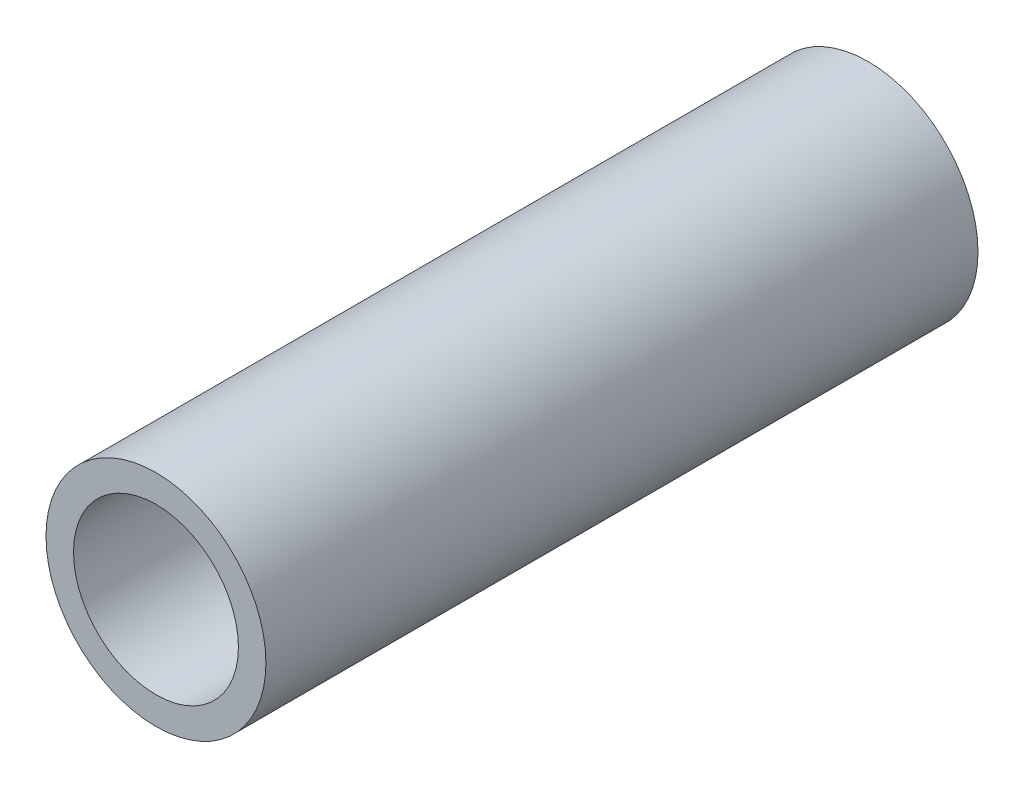
ISO-10303-21;
HEADER;
FILE_DESCRIPTION(('STEP AP214'),'2;1');
FILE_NAME('part.step','',(''),(''),'','','');
FILE_SCHEMA(('AUTOMOTIVE_DESIGN { 1 0 10303 214 1 1 1 1 }'));
ENDSEC;
DATA;
#1=APPLICATION_CONTEXT('core data for automotive mechanical design processes');
#2=APPLICATION_PROTOCOL_DEFINITION('international standard','automotive_design',2000,#1);
#3=PRODUCT_CONTEXT('',#1,'mechanical');
#4=PRODUCT('Part','Part','',(#3));
#5=PRODUCT_RELATED_PRODUCT_CATEGORY('part','',(#4));
#6=PRODUCT_DEFINITION_FORMATION('','',#4);
#7=PRODUCT_DEFINITION_CONTEXT('part definition',#1,'design');
#8=PRODUCT_DEFINITION('design','',#6,#7);
#9=PRODUCT_DEFINITION_SHAPE('','',#8);
#10=(LENGTH_UNIT() NAMED_UNIT(*) SI_UNIT(.MILLI.,.METRE.));
#11=(NAMED_UNIT(*) PLANE_ANGLE_UNIT() SI_UNIT($,.RADIAN.));
#12=(NAMED_UNIT(*) SI_UNIT($,.STERADIAN.) SOLID_ANGLE_UNIT());
#13=UNCERTAINTY_MEASURE_WITH_UNIT(LENGTH_MEASURE(1.E-05),#10,'distance_accuracy_value','');
#14=(GEOMETRIC_REPRESENTATION_CONTEXT(3) GLOBAL_UNCERTAINTY_ASSIGNED_CONTEXT((#13)) GLOBAL_UNIT_ASSIGNED_CONTEXT((#10,
#11,#12)) REPRESENTATION_CONTEXT('',''));
#15=CARTESIAN_POINT('',(0.,0.,0.));
#16=DIRECTION('',(0.,0.,1.));
#17=DIRECTION('',(1.,0.,0.));
#18=AXIS2_PLACEMENT_3D('',#15,#16,#17);
#19=CARTESIAN_POINT('',(0.,0.,27.2));
#20=DIRECTION('',(0.,0.,1.));
#21=DIRECTION('',(1.,0.,0.));
#22=AXIS2_PLACEMENT_3D('',#19,#20,#21);
#23=PLANE('',#22);
#24=CARTESIAN_POINT('',(0.,0.,27.2));
#25=DIRECTION('',(0.,0.,1.));
#26=DIRECTION('',(1.,0.,0.));
#27=AXIS2_PLACEMENT_3D('',#24,#25,#26);
#28=CIRCLE('',#27,4.2);
#29=CARTESIAN_POINT('',(4.2,0.,27.2));
#30=VERTEX_POINT('',#29);
#31=EDGE_CURVE('E10',#30,#30,#28,.T.);
#32=ORIENTED_EDGE('',*,*,#31,.T.);
#33=EDGE_LOOP('',(#32));
#34=FACE_BOUND('',#33,.T.);
#35=CARTESIAN_POINT('',(0.,0.,27.2));
#36=DIRECTION('',(0.,0.,1.));
#37=DIRECTION('',(1.,0.,0.));
#38=AXIS2_PLACEMENT_3D('',#35,#36,#37);
#39=CIRCLE('',#38,3.15);
#40=CARTESIAN_POINT('',(3.15,0.,27.2));
#41=VERTEX_POINT('',#40);
#42=EDGE_CURVE('E48',#41,#41,#39,.T.);
#43=ORIENTED_EDGE('',*,*,#42,.F.);
#44=EDGE_LOOP('',(#43));
#45=FACE_BOUND('',#44,.T.);
#46=ADVANCED_FACE('F40',(#34,#45),#23,.T.);
#47=CARTESIAN_POINT('',(0.,0.,0.));
#48=DIRECTION('',(0.,0.,1.));
#49=DIRECTION('',(1.,0.,0.));
#50=AXIS2_PLACEMENT_3D('',#47,#48,#49);
#51=PLANE('',#50);
#52=CARTESIAN_POINT('',(0.,0.,0.));
#53=DIRECTION('',(0.,0.,1.));
#54=DIRECTION('',(1.,0.,0.));
#55=AXIS2_PLACEMENT_3D('',#52,#53,#54);
#56=CIRCLE('',#55,4.2);
#57=CARTESIAN_POINT('',(4.2,0.,0.));
#58=VERTEX_POINT('',#57);
#59=EDGE_CURVE('E41',#58,#58,#56,.T.);
#60=ORIENTED_EDGE('',*,*,#59,.F.);
#61=EDGE_LOOP('',(#60));
#62=FACE_BOUND('',#61,.T.);
#63=CARTESIAN_POINT('',(0.,0.,0.));
#64=DIRECTION('',(0.,0.,1.));
#65=DIRECTION('',(1.,0.,0.));
#66=AXIS2_PLACEMENT_3D('',#63,#64,#65);
#67=CIRCLE('',#66,3.15);
#68=CARTESIAN_POINT('',(3.15,0.,0.));
#69=VERTEX_POINT('',#68);
#70=EDGE_CURVE('E49',#69,#69,#67,.T.);
#71=ORIENTED_EDGE('',*,*,#70,.T.);
#72=EDGE_LOOP('',(#71));
#73=FACE_BOUND('',#72,.T.);
#74=ADVANCED_FACE('F58',(#62,#73),#51,.F.);
#75=CARTESIAN_POINT('',(0.,0.,27.2));
#76=DIRECTION('',(0.,0.,-1.));
#77=DIRECTION('',(-1.,0.,0.));
#78=AXIS2_PLACEMENT_3D('',#75,#76,#77);
#79=CYLINDRICAL_SURFACE('',#78,4.2);
#80=ORIENTED_EDGE('',*,*,#31,.F.);
#81=EDGE_LOOP('',(#80));
#82=FACE_BOUND('',#81,.T.);
#83=ORIENTED_EDGE('',*,*,#59,.T.);
#84=EDGE_LOOP('',(#83));
#85=FACE_BOUND('',#84,.T.);
#86=ADVANCED_FACE('F39',(#82,#85),#79,.T.);
#87=CARTESIAN_POINT('',(0.,0.,27.2));
#88=DIRECTION('',(0.,0.,-1.));
#89=DIRECTION('',(-1.,0.,0.));
#90=AXIS2_PLACEMENT_3D('',#87,#88,#89);
#91=CYLINDRICAL_SURFACE('',#90,3.15);
#92=ORIENTED_EDGE('',*,*,#42,.T.);
#93=EDGE_LOOP('',(#92));
#94=FACE_BOUND('',#93,.T.);
#95=ORIENTED_EDGE('',*,*,#70,.F.);
#96=EDGE_LOOP('',(#95));
#97=FACE_BOUND('',#96,.T.);
#98=ADVANCED_FACE('F57',(#94,#97),#91,.F.);
#99=CLOSED_SHELL('',(#46,#74,#86,#98));
#100=MANIFOLD_SOLID_BREP('B2',#99);
#101=ADVANCED_BREP_SHAPE_REPRESENTATION('',(#18,#100),#14);
#102=SHAPE_DEFINITION_REPRESENTATION(#9,#101);
ENDSEC;
END-ISO-10303-21;
